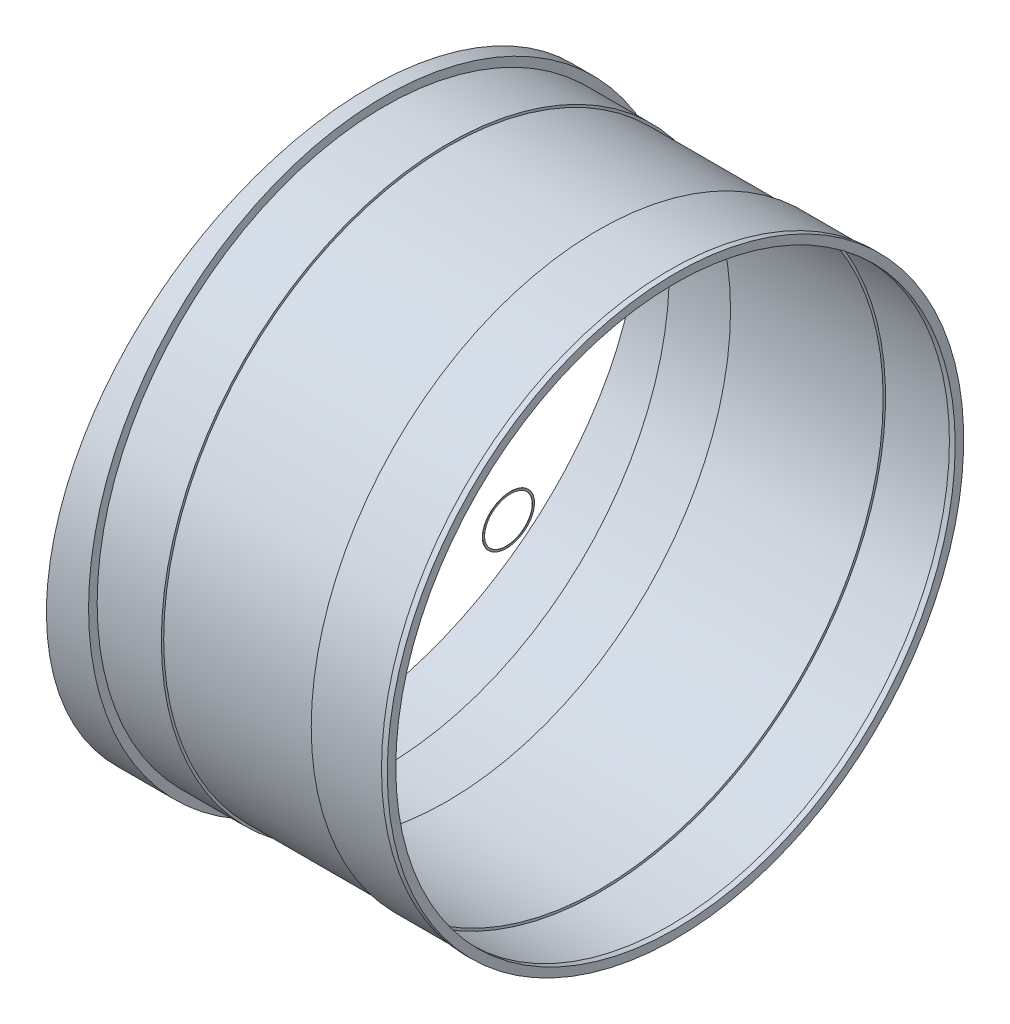
ISO-10303-21;
HEADER;
FILE_DESCRIPTION(('STEP AP214'),'2;1');
FILE_NAME('part.step','',(''),(''),'','','');
FILE_SCHEMA(('AUTOMOTIVE_DESIGN { 1 0 10303 214 1 1 1 1 }'));
ENDSEC;
DATA;
#1=APPLICATION_CONTEXT('core data for automotive mechanical design processes');
#2=APPLICATION_PROTOCOL_DEFINITION('international standard','automotive_design',2000,#1);
#3=PRODUCT_CONTEXT('',#1,'mechanical');
#4=PRODUCT('Part','Part','',(#3));
#5=PRODUCT_RELATED_PRODUCT_CATEGORY('part','',(#4));
#6=PRODUCT_DEFINITION_FORMATION('','',#4);
#7=PRODUCT_DEFINITION_CONTEXT('part definition',#1,'design');
#8=PRODUCT_DEFINITION('design','',#6,#7);
#9=PRODUCT_DEFINITION_SHAPE('','',#8);
#10=(LENGTH_UNIT() NAMED_UNIT(*) SI_UNIT(.MILLI.,.METRE.));
#11=(NAMED_UNIT(*) PLANE_ANGLE_UNIT() SI_UNIT($,.RADIAN.));
#12=(NAMED_UNIT(*) SI_UNIT($,.STERADIAN.) SOLID_ANGLE_UNIT());
#13=UNCERTAINTY_MEASURE_WITH_UNIT(LENGTH_MEASURE(1.E-05),#10,'distance_accuracy_value','');
#14=(GEOMETRIC_REPRESENTATION_CONTEXT(3) GLOBAL_UNCERTAINTY_ASSIGNED_CONTEXT((#13)) GLOBAL_UNIT_ASSIGNED_CONTEXT((#10,
#11,#12)) REPRESENTATION_CONTEXT('',''));
#15=CARTESIAN_POINT('',(0.,0.,0.));
#16=DIRECTION('',(0.,0.,1.));
#17=DIRECTION('',(1.,0.,0.));
#18=AXIS2_PLACEMENT_3D('',#15,#16,#17);
#19=CARTESIAN_POINT('',(-739.32525534607,34.3574521001771,-0.182478435002679));
#20=DIRECTION('',(-1.,0.,0.));
#21=DIRECTION('',(0.,0.,1.));
#22=AXIS2_PLACEMENT_3D('',#19,#20,#21);
#23=CYLINDRICAL_SURFACE('',#22,1156.34241950256);
#24=CARTESIAN_POINT('',(-477.882411014793,34.3574521001771,-0.182478435002679));
#25=DIRECTION('',(-1.,0.,0.));
#26=DIRECTION('',(0.,0.,1.));
#27=AXIS2_PLACEMENT_3D('',#24,#25,#26);
#28=CIRCLE('',#27,1156.34241950256);
#29=CARTESIAN_POINT('',(-477.882411014793,34.3574521001771,1156.15994106756));
#30=VERTEX_POINT('',#29);
#31=EDGE_CURVE('E81',#30,#30,#28,.T.);
#32=ORIENTED_EDGE('',*,*,#31,.T.);
#33=EDGE_LOOP('',(#32));
#34=FACE_BOUND('',#33,.T.);
#35=CARTESIAN_POINT('',(-638.158402485462,34.3574521001771,-0.182478435002679));
#36=DIRECTION('',(-0.996194698091746,0.0871557427476543,0.));
#37=DIRECTION('',(-0.0871557427476543,-0.996194698091746,0.));
#38=AXIS2_PLACEMENT_3D('',#35,#36,#37);
#39=ELLIPSE('',#38,1160.75945968954,1156.34241950256);
#40=CARTESIAN_POINT('',(-739.32525534607,-1121.98496740238,-0.182478435002679));
#41=VERTEX_POINT('',#40);
#42=EDGE_CURVE('E105',#41,#41,#39,.F.);
#43=ORIENTED_EDGE('',*,*,#42,.T.);
#44=EDGE_LOOP('',(#43));
#45=FACE_BOUND('',#44,.T.);
#46=ADVANCED_FACE('F43',(#34,#45),#23,.T.);
#47=CARTESIAN_POINT('',(-739.32525534607,34.3574521001771,-0.182478435002679));
#48=DIRECTION('',(-1.,0.,0.));
#49=DIRECTION('',(0.,0.,1.));
#50=AXIS2_PLACEMENT_3D('',#47,#48,#49);
#51=CYLINDRICAL_SURFACE('',#50,1152.57828411877);
#52=CARTESIAN_POINT('',(-481.553718996993,34.3574521001771,-0.182478435002679));
#53=DIRECTION('',(-1.,0.,0.));
#54=DIRECTION('',(0.,0.,1.));
#55=AXIS2_PLACEMENT_3D('',#52,#53,#54);
#56=CIRCLE('',#55,1152.57828411877);
#57=CARTESIAN_POINT('',(-481.553718996993,34.3574521001771,1152.39580568377));
#58=VERTEX_POINT('',#57);
#59=EDGE_CURVE('E84',#58,#58,#56,.T.);
#60=ORIENTED_EDGE('',*,*,#59,.F.);
#61=EDGE_LOOP('',(#60));
#62=FACE_BOUND('',#61,.T.);
#63=CARTESIAN_POINT('',(-638.158402485462,34.3574521001771,-0.182478435002679));
#64=DIRECTION('',(-0.996194698091746,0.0871557427476543,0.));
#65=DIRECTION('',(-0.0871557427476543,-0.996194698091746,0.));
#66=AXIS2_PLACEMENT_3D('',#63,#64,#65);
#67=ELLIPSE('',#66,1156.98094592009,1152.57828411877);
#68=CARTESIAN_POINT('',(-738.995936172012,-1118.22083201859,-0.182478435002679));
#69=VERTEX_POINT('',#68);
#70=EDGE_CURVE('E47',#69,#69,#67,.F.);
#71=ORIENTED_EDGE('',*,*,#70,.F.);
#72=EDGE_LOOP('',(#71));
#73=FACE_BOUND('',#72,.T.);
#74=ADVANCED_FACE('F114',(#62,#73),#51,.F.);
#75=CARTESIAN_POINT('',(638.985832011451,34.3574521001771,-0.182478435002679));
#76=DIRECTION('',(-1.,0.,0.));
#77=DIRECTION('',(0.,0.,1.));
#78=AXIS2_PLACEMENT_3D('',#75,#76,#77);
#79=PLANE('',#78);
#80=CARTESIAN_POINT('',(638.985832011451,34.3574521001771,-0.182478435002679));
#81=DIRECTION('',(-1.,0.,0.));
#82=DIRECTION('',(0.,0.,1.));
#83=AXIS2_PLACEMENT_3D('',#80,#81,#82);
#84=CIRCLE('',#83,1118.74566032021);
#85=CARTESIAN_POINT('',(638.985832011451,34.3574521001771,1118.5631818852));
#86=VERTEX_POINT('',#85);
#87=EDGE_CURVE('E102',#86,#86,#84,.T.);
#88=ORIENTED_EDGE('',*,*,#87,.T.);
#89=EDGE_LOOP('',(#88));
#90=FACE_BOUND('',#89,.T.);
#91=CARTESIAN_POINT('',(638.985832011451,34.3574521001771,-0.182478435002679));
#92=DIRECTION('',(-1.,0.,0.));
#93=DIRECTION('',(0.,0.,1.));
#94=AXIS2_PLACEMENT_3D('',#91,#92,#93);
#95=CIRCLE('',#94,1094.09192970876);
#96=CARTESIAN_POINT('',(638.985832011451,34.3574521001771,1093.90945127375));
#97=VERTEX_POINT('',#96);
#98=EDGE_CURVE('E11',#97,#97,#95,.T.);
#99=ORIENTED_EDGE('',*,*,#98,.F.);
#100=EDGE_LOOP('',(#99));
#101=FACE_BOUND('',#100,.T.);
#102=ADVANCED_FACE('F45',(#90,#101),#79,.T.);
#103=CARTESIAN_POINT('',(-739.32525534607,34.3574521001771,-0.182478435002679));
#104=DIRECTION('',(-1.,0.,0.));
#105=DIRECTION('',(0.,0.,1.));
#106=AXIS2_PLACEMENT_3D('',#103,#104,#105);
#107=CYLINDRICAL_SURFACE('',#106,1094.09192970876);
#108=ORIENTED_EDGE('',*,*,#98,.T.);
#109=EDGE_LOOP('',(#108));
#110=FACE_BOUND('',#109,.T.);
#111=CARTESIAN_POINT('',(661.552204701918,34.3574521001771,-0.182478435002679));
#112=DIRECTION('',(-1.,0.,0.));
#113=DIRECTION('',(0.,0.,1.));
#114=AXIS2_PLACEMENT_3D('',#111,#112,#113);
#115=CIRCLE('',#114,1094.09192970876);
#116=CARTESIAN_POINT('',(661.552204701918,34.3574521001771,1093.90945127375));
#117=VERTEX_POINT('',#116);
#118=EDGE_CURVE('E51',#117,#117,#115,.T.);
#119=ORIENTED_EDGE('',*,*,#118,.F.);
#120=EDGE_LOOP('',(#119));
#121=FACE_BOUND('',#120,.T.);
#122=ADVANCED_FACE('F122',(#110,#121),#107,.F.);
#123=CARTESIAN_POINT('',(661.552204701918,34.3574521001771,-0.182478435002679));
#124=DIRECTION('',(1.,0.,0.));
#125=DIRECTION('',(0.,0.,-1.));
#126=AXIS2_PLACEMENT_3D('',#123,#124,#125);
#127=PLANE('',#126);
#128=ORIENTED_EDGE('',*,*,#118,.T.);
#129=EDGE_LOOP('',(#128));
#130=FACE_BOUND('',#129,.T.);
#131=CARTESIAN_POINT('',(661.552204701918,34.3574521001771,-0.182478435002679));
#132=DIRECTION('',(-1.,0.,0.));
#133=DIRECTION('',(0.,0.,1.));
#134=AXIS2_PLACEMENT_3D('',#131,#132,#133);
#135=CIRCLE('',#134,1127.4062881664);
#136=CARTESIAN_POINT('',(661.552204701918,34.3574521001771,1127.2238097314));
#137=VERTEX_POINT('',#136);
#138=EDGE_CURVE('E55',#137,#137,#135,.T.);
#139=ORIENTED_EDGE('',*,*,#138,.F.);
#140=EDGE_LOOP('',(#139));
#141=FACE_BOUND('',#140,.T.);
#142=ADVANCED_FACE('F162',(#130,#141),#127,.T.);
#143=CARTESIAN_POINT('',(-739.32525534607,34.3574521001771,-0.182478435002679));
#144=DIRECTION('',(-1.,0.,0.));
#145=DIRECTION('',(0.,0.,1.));
#146=AXIS2_PLACEMENT_3D('',#143,#144,#145);
#147=CYLINDRICAL_SURFACE('',#146,1127.4062881664);
#148=ORIENTED_EDGE('',*,*,#138,.T.);
#149=EDGE_LOOP('',(#148));
#150=FACE_BOUND('',#149,.T.);
#151=CARTESIAN_POINT('',(638.985832011451,34.3574521001771,-0.182478435002679));
#152=DIRECTION('',(-1.,0.,0.));
#153=DIRECTION('',(0.,0.,1.));
#154=AXIS2_PLACEMENT_3D('',#151,#152,#153);
#155=CIRCLE('',#154,1127.4062881664);
#156=CARTESIAN_POINT('',(638.985832011451,34.3574521001771,1127.2238097314));
#157=VERTEX_POINT('',#156);
#158=EDGE_CURVE('E60',#157,#157,#155,.T.);
#159=ORIENTED_EDGE('',*,*,#158,.F.);
#160=EDGE_LOOP('',(#159));
#161=FACE_BOUND('',#160,.T.);
#162=ADVANCED_FACE('F158',(#150,#161),#147,.T.);
#163=CARTESIAN_POINT('',(638.985832011451,34.3574521001771,-0.182478435002679));
#164=DIRECTION('',(-1.,0.,0.));
#165=DIRECTION('',(0.,0.,1.));
#166=AXIS2_PLACEMENT_3D('',#163,#164,#165);
#167=PLANE('',#166);
#168=ORIENTED_EDGE('',*,*,#158,.T.);
#169=EDGE_LOOP('',(#168));
#170=FACE_BOUND('',#169,.T.);
#171=CARTESIAN_POINT('',(638.985832011451,34.3574521001771,-0.182478435002679));
#172=DIRECTION('',(-1.,0.,0.));
#173=DIRECTION('',(0.,0.,1.));
#174=AXIS2_PLACEMENT_3D('',#171,#172,#173);
#175=CIRCLE('',#174,1122.70778083857);
#176=CARTESIAN_POINT('',(638.985832011451,34.3574521001771,1122.52530240356));
#177=VERTEX_POINT('',#176);
#178=EDGE_CURVE('E63',#177,#177,#175,.T.);
#179=ORIENTED_EDGE('',*,*,#178,.F.);
#180=EDGE_LOOP('',(#179));
#181=FACE_BOUND('',#180,.T.);
#182=ADVANCED_FACE('F154',(#170,#181),#167,.T.);
#183=CARTESIAN_POINT('',(-739.32525534607,34.3574521001771,-0.182478435002679));
#184=DIRECTION('',(-1.,0.,0.));
#185=DIRECTION('',(0.,0.,1.));
#186=AXIS2_PLACEMENT_3D('',#183,#184,#185);
#187=CYLINDRICAL_SURFACE('',#186,1122.70778083857);
#188=ORIENTED_EDGE('',*,*,#178,.T.);
#189=EDGE_LOOP('',(#188));
#190=FACE_BOUND('',#189,.T.);
#191=CARTESIAN_POINT('',(359.448145681241,34.3574521001771,-0.182478435002679));
#192=DIRECTION('',(-1.,0.,0.));
#193=DIRECTION('',(0.,0.,1.));
#194=AXIS2_PLACEMENT_3D('',#191,#192,#193);
#195=CIRCLE('',#194,1122.70778083857);
#196=CARTESIAN_POINT('',(359.448145681241,34.3574521001771,1122.52530240356));
#197=VERTEX_POINT('',#196);
#198=EDGE_CURVE('E66',#197,#197,#195,.T.);
#199=ORIENTED_EDGE('',*,*,#198,.F.);
#200=EDGE_LOOP('',(#199));
#201=FACE_BOUND('',#200,.T.);
#202=ADVANCED_FACE('F150',(#190,#201),#187,.T.);
#203=CARTESIAN_POINT('',(359.448145681241,34.3574521001771,-0.182478435002679));
#204=DIRECTION('',(-1.,0.,0.));
#205=DIRECTION('',(0.,0.,1.));
#206=AXIS2_PLACEMENT_3D('',#203,#204,#205);
#207=PLANE('',#206);
#208=ORIENTED_EDGE('',*,*,#198,.T.);
#209=EDGE_LOOP('',(#208));
#210=FACE_BOUND('',#209,.T.);
#211=CARTESIAN_POINT('',(359.448145681241,34.3574521001771,-0.182478435002679));
#212=DIRECTION('',(-1.,0.,0.));
#213=DIRECTION('',(0.,0.,1.));
#214=AXIS2_PLACEMENT_3D('',#211,#212,#213);
#215=CIRCLE('',#214,1113.46129915592);
#216=CARTESIAN_POINT('',(359.448145681241,34.3574521001771,1113.27882072092));
#217=VERTEX_POINT('',#216);
#218=EDGE_CURVE('E69',#217,#217,#215,.T.);
#219=ORIENTED_EDGE('',*,*,#218,.F.);
#220=EDGE_LOOP('',(#219));
#221=FACE_BOUND('',#220,.T.);
#222=ADVANCED_FACE('F146',(#210,#221),#207,.T.);
#223=CARTESIAN_POINT('',(-739.32525534607,34.3574521001771,-0.182478435002679));
#224=DIRECTION('',(-1.,0.,0.));
#225=DIRECTION('',(0.,0.,1.));
#226=AXIS2_PLACEMENT_3D('',#223,#224,#225);
#227=CYLINDRICAL_SURFACE('',#226,1113.46129915592);
#228=ORIENTED_EDGE('',*,*,#218,.T.);
#229=EDGE_LOOP('',(#228));
#230=FACE_BOUND('',#229,.T.);
#231=CARTESIAN_POINT('',(-226.892026536555,34.3574521001771,-0.182478435002679));
#232=DIRECTION('',(-1.,0.,0.));
#233=DIRECTION('',(0.,0.,1.));
#234=AXIS2_PLACEMENT_3D('',#231,#232,#233);
#235=CIRCLE('',#234,1113.46129915592);
#236=CARTESIAN_POINT('',(-226.892026536555,34.3574521001771,1113.27882072092));
#237=VERTEX_POINT('',#236);
#238=EDGE_CURVE('E72',#237,#237,#235,.T.);
#239=ORIENTED_EDGE('',*,*,#238,.F.);
#240=EDGE_LOOP('',(#239));
#241=FACE_BOUND('',#240,.T.);
#242=ADVANCED_FACE('F142',(#230,#241),#227,.T.);
#243=CARTESIAN_POINT('',(-226.892026536555,34.3574521001771,-0.182478435002679));
#244=DIRECTION('',(1.,0.,0.));
#245=DIRECTION('',(0.,0.,-1.));
#246=AXIS2_PLACEMENT_3D('',#243,#244,#245);
#247=PLANE('',#246);
#248=ORIENTED_EDGE('',*,*,#238,.T.);
#249=EDGE_LOOP('',(#248));
#250=FACE_BOUND('',#249,.T.);
#251=CARTESIAN_POINT('',(-226.892026536555,34.3574521001771,-0.182478435002679));
#252=DIRECTION('',(-1.,0.,0.));
#253=DIRECTION('',(0.,0.,1.));
#254=AXIS2_PLACEMENT_3D('',#251,#252,#253);
#255=CIRCLE('',#254,1122.70778083857);
#256=CARTESIAN_POINT('',(-226.892026536555,34.3574521001771,1122.52530240356));
#257=VERTEX_POINT('',#256);
#258=EDGE_CURVE('E75',#257,#257,#255,.T.);
#259=ORIENTED_EDGE('',*,*,#258,.F.);
#260=EDGE_LOOP('',(#259));
#261=FACE_BOUND('',#260,.T.);
#262=ADVANCED_FACE('F138',(#250,#261),#247,.T.);
#263=CARTESIAN_POINT('',(-739.32525534607,34.3574521001771,-0.182478435002679));
#264=DIRECTION('',(-1.,0.,0.));
#265=DIRECTION('',(0.,0.,1.));
#266=AXIS2_PLACEMENT_3D('',#263,#264,#265);
#267=CYLINDRICAL_SURFACE('',#266,1122.70778083857);
#268=ORIENTED_EDGE('',*,*,#258,.T.);
#269=EDGE_LOOP('',(#268));
#270=FACE_BOUND('',#269,.T.);
#271=CARTESIAN_POINT('',(-477.882411014793,34.3574521001771,-0.182478435002679));
#272=DIRECTION('',(-1.,0.,0.));
#273=DIRECTION('',(0.,0.,1.));
#274=AXIS2_PLACEMENT_3D('',#271,#272,#273);
#275=CIRCLE('',#274,1122.70778083857);
#276=CARTESIAN_POINT('',(-477.882411014793,34.3574521001771,1122.52530240356));
#277=VERTEX_POINT('',#276);
#278=EDGE_CURVE('E78',#277,#277,#275,.T.);
#279=ORIENTED_EDGE('',*,*,#278,.F.);
#280=EDGE_LOOP('',(#279));
#281=FACE_BOUND('',#280,.T.);
#282=ADVANCED_FACE('F134',(#270,#281),#267,.T.);
#283=CARTESIAN_POINT('',(-477.882411014793,34.3574521001771,-0.182478435002679));
#284=DIRECTION('',(1.,0.,0.));
#285=DIRECTION('',(0.,0.,-1.));
#286=AXIS2_PLACEMENT_3D('',#283,#284,#285);
#287=PLANE('',#286);
#288=ORIENTED_EDGE('',*,*,#278,.T.);
#289=EDGE_LOOP('',(#288));
#290=FACE_BOUND('',#289,.T.);
#291=ORIENTED_EDGE('',*,*,#31,.F.);
#292=EDGE_LOOP('',(#291));
#293=FACE_BOUND('',#292,.T.);
#294=ADVANCED_FACE('F131',(#290,#293),#287,.T.);
#295=CARTESIAN_POINT('',(-481.553718996993,34.3574521001771,-0.182478435002679));
#296=DIRECTION('',(1.,0.,0.));
#297=DIRECTION('',(0.,0.,-1.));
#298=AXIS2_PLACEMENT_3D('',#295,#296,#297);
#299=PLANE('',#298);
#300=CARTESIAN_POINT('',(-481.553718996993,34.3574521001771,-0.182478435002679));
#301=DIRECTION('',(-1.,0.,0.));
#302=DIRECTION('',(0.,0.,1.));
#303=AXIS2_PLACEMENT_3D('',#300,#301,#302);
#304=CIRCLE('',#303,1118.74566032021);
#305=CARTESIAN_POINT('',(-481.553718996993,34.3574521001771,1118.5631818852));
#306=VERTEX_POINT('',#305);
#307=EDGE_CURVE('E87',#306,#306,#304,.T.);
#308=ORIENTED_EDGE('',*,*,#307,.F.);
#309=EDGE_LOOP('',(#308));
#310=FACE_BOUND('',#309,.T.);
#311=ORIENTED_EDGE('',*,*,#59,.T.);
#312=EDGE_LOOP('',(#311));
#313=FACE_BOUND('',#312,.T.);
#314=ADVANCED_FACE('F128',(#310,#313),#299,.F.);
#315=CARTESIAN_POINT('',(-739.32525534607,34.3574521001771,-0.182478435002679));
#316=DIRECTION('',(-1.,0.,0.));
#317=DIRECTION('',(0.,0.,1.));
#318=AXIS2_PLACEMENT_3D('',#315,#316,#317);
#319=CYLINDRICAL_SURFACE('',#318,1118.74566032021);
#320=CARTESIAN_POINT('',(-232.610160771384,34.3574521001771,-0.182478435002679));
#321=DIRECTION('',(-1.,0.,0.));
#322=DIRECTION('',(0.,0.,1.));
#323=AXIS2_PLACEMENT_3D('',#320,#321,#322);
#324=CIRCLE('',#323,1118.74566032021);
#325=CARTESIAN_POINT('',(-232.610160771384,34.3574521001771,1118.5631818852));
#326=VERTEX_POINT('',#325);
#327=EDGE_CURVE('E90',#326,#326,#324,.T.);
#328=ORIENTED_EDGE('',*,*,#327,.F.);
#329=EDGE_LOOP('',(#328));
#330=FACE_BOUND('',#329,.T.);
#331=ORIENTED_EDGE('',*,*,#307,.T.);
#332=EDGE_LOOP('',(#331));
#333=FACE_BOUND('',#332,.T.);
#334=ADVANCED_FACE('F233',(#330,#333),#319,.F.);
#335=CARTESIAN_POINT('',(-232.610160771384,34.3574521001771,-0.182478435002679));
#336=DIRECTION('',(1.,0.,0.));
#337=DIRECTION('',(0.,0.,-1.));
#338=AXIS2_PLACEMENT_3D('',#335,#336,#337);
#339=PLANE('',#338);
#340=CARTESIAN_POINT('',(-232.610160771384,34.3574521001771,-0.182478435002679));
#341=DIRECTION('',(-1.,0.,0.));
#342=DIRECTION('',(0.,0.,1.));
#343=AXIS2_PLACEMENT_3D('',#340,#341,#342);
#344=CIRCLE('',#343,1109.48945498159);
#345=CARTESIAN_POINT('',(-232.610160771384,34.3574521001771,1109.30697654658));
#346=VERTEX_POINT('',#345);
#347=EDGE_CURVE('E93',#346,#346,#344,.T.);
#348=ORIENTED_EDGE('',*,*,#347,.F.);
#349=EDGE_LOOP('',(#348));
#350=FACE_BOUND('',#349,.T.);
#351=ORIENTED_EDGE('',*,*,#327,.T.);
#352=EDGE_LOOP('',(#351));
#353=FACE_BOUND('',#352,.T.);
#354=ADVANCED_FACE('F240',(#350,#353),#339,.F.);
#355=CARTESIAN_POINT('',(-739.32525534607,34.3574521001771,-0.182478435002679));
#356=DIRECTION('',(-1.,0.,0.));
#357=DIRECTION('',(0.,0.,1.));
#358=AXIS2_PLACEMENT_3D('',#355,#356,#357);
#359=CYLINDRICAL_SURFACE('',#358,1109.48945498159);
#360=CARTESIAN_POINT('',(364.410364551892,34.3574521001771,-0.182478435002679));
#361=DIRECTION('',(-1.,0.,0.));
#362=DIRECTION('',(0.,0.,1.));
#363=AXIS2_PLACEMENT_3D('',#360,#361,#362);
#364=CIRCLE('',#363,1109.48945498159);
#365=CARTESIAN_POINT('',(364.410364551892,34.3574521001771,1109.30697654658));
#366=VERTEX_POINT('',#365);
#367=EDGE_CURVE('E96',#366,#366,#364,.T.);
#368=ORIENTED_EDGE('',*,*,#367,.F.);
#369=EDGE_LOOP('',(#368));
#370=FACE_BOUND('',#369,.T.);
#371=ORIENTED_EDGE('',*,*,#347,.T.);
#372=EDGE_LOOP('',(#371));
#373=FACE_BOUND('',#372,.T.);
#374=ADVANCED_FACE('F247',(#370,#373),#359,.F.);
#375=CARTESIAN_POINT('',(364.410364551892,34.3574521001771,-0.182478435002679));
#376=DIRECTION('',(-1.,0.,0.));
#377=DIRECTION('',(0.,0.,1.));
#378=AXIS2_PLACEMENT_3D('',#375,#376,#377);
#379=PLANE('',#378);
#380=CARTESIAN_POINT('',(364.410364551892,34.3574521001771,-0.182478435002679));
#381=DIRECTION('',(-1.,0.,0.));
#382=DIRECTION('',(0.,0.,1.));
#383=AXIS2_PLACEMENT_3D('',#380,#381,#382);
#384=CIRCLE('',#383,1118.74566032021);
#385=CARTESIAN_POINT('',(364.410364551892,34.3574521001771,1118.5631818852));
#386=VERTEX_POINT('',#385);
#387=EDGE_CURVE('E99',#386,#386,#384,.T.);
#388=ORIENTED_EDGE('',*,*,#387,.F.);
#389=EDGE_LOOP('',(#388));
#390=FACE_BOUND('',#389,.T.);
#391=ORIENTED_EDGE('',*,*,#367,.T.);
#392=EDGE_LOOP('',(#391));
#393=FACE_BOUND('',#392,.T.);
#394=ADVANCED_FACE('F255',(#390,#393),#379,.F.);
#395=CARTESIAN_POINT('',(-739.32525534607,34.3574521001771,-0.182478435002679));
#396=DIRECTION('',(-1.,0.,0.));
#397=DIRECTION('',(0.,0.,1.));
#398=AXIS2_PLACEMENT_3D('',#395,#396,#397);
#399=CYLINDRICAL_SURFACE('',#398,1118.74566032021);
#400=ORIENTED_EDGE('',*,*,#87,.F.);
#401=EDGE_LOOP('',(#400));
#402=FACE_BOUND('',#401,.T.);
#403=ORIENTED_EDGE('',*,*,#387,.T.);
#404=EDGE_LOOP('',(#403));
#405=FACE_BOUND('',#404,.T.);
#406=ADVANCED_FACE('F263',(#402,#405),#399,.F.);
#407=CARTESIAN_POINT('',(-634.930532445921,71.2521754786492,-113.514214061284));
#408=DIRECTION('',(-0.996194698091746,0.0871557427476543,0.));
#409=DIRECTION('',(-0.0871557427476543,-0.996194698091746,0.));
#410=AXIS2_PLACEMENT_3D('',#407,#408,#409);
#411=PLANE('',#410);
#412=ORIENTED_EDGE('',*,*,#42,.F.);
#413=EDGE_LOOP('',(#412));
#414=FACE_BOUND('',#413,.T.);
#415=ORIENTED_EDGE('',*,*,#70,.T.);
#416=EDGE_LOOP('',(#415));
#417=FACE_BOUND('',#416,.T.);
#418=ADVANCED_FACE('F112',(#414,#417),#411,.T.);
#419=CLOSED_SHELL('',(#46,#74,#102,#122,#142,#162,#182,#202,#222,#242,#262,#282,#294,#314,#334,
#354,#374,#394,#406,#418));
#420=MANIFOLD_SOLID_BREP('B2',#419);
#421=CARTESIAN_POINT('',(7.55616015890316,-0.661078353690241,0.));
#422=DIRECTION('',(-0.996194698091746,0.0871557427476543,0.));
#423=DIRECTION('',(-0.0871557427476543,-0.996194698091746,0.));
#424=AXIS2_PLACEMENT_3D('',#421,#422,#423);
#425=PLANE('',#424);
#426=CARTESIAN_POINT('',(7.55616015890316,-0.661078353690241,0.));
#427=DIRECTION('',(-0.996194698091746,0.0871557427476543,0.));
#428=DIRECTION('',(-0.0871557427476543,-0.996194698091746,0.));
#429=AXIS2_PLACEMENT_3D('',#426,#427,#428);
#430=CIRCLE('',#429,101.213381326121);
#431=CARTESIAN_POINT('',(-1.26516726657652,-101.48931220671,0.));
#432=VERTEX_POINT('',#431);
#433=EDGE_CURVE('E42',#432,#432,#430,.T.);
#434=ORIENTED_EDGE('',*,*,#433,.T.);
#435=EDGE_LOOP('',(#434));
#436=FACE_BOUND('',#435,.T.);
#437=CARTESIAN_POINT('',(7.55616015890316,-0.661078353690241,0.));
#438=DIRECTION('',(-0.996194698091746,0.0871557427476543,0.));
#439=DIRECTION('',(-0.0871557427476543,-0.996194698091746,0.));
#440=AXIS2_PLACEMENT_3D('',#437,#438,#439);
#441=CIRCLE('',#440,93.3820075730115);
#442=CARTESIAN_POINT('',(-0.582618070389739,-93.6877391950876,0.));
#443=VERTEX_POINT('',#442);
#444=EDGE_CURVE('E365',#443,#443,#441,.T.);
#445=ORIENTED_EDGE('',*,*,#444,.F.);
#446=EDGE_LOOP('',(#445));
#447=FACE_BOUND('',#446,.T.);
#448=ADVANCED_FACE('F354',(#436,#447),#425,.T.);
#449=CARTESIAN_POINT('',(8.82132742547968,-0.771766146979762,0.));
#450=DIRECTION('',(-0.996194698091746,0.0871557427476543,0.));
#451=DIRECTION('',(-0.0871557427476543,-0.996194698091746,0.));
#452=AXIS2_PLACEMENT_3D('',#449,#450,#451);
#453=PLANE('',#452);
#454=CARTESIAN_POINT('',(8.82132742547968,-0.771766146979762,0.));
#455=DIRECTION('',(-0.996194698091746,0.0871557427476543,0.));
#456=DIRECTION('',(-0.0871557427476543,-0.996194698091746,0.));
#457=AXIS2_PLACEMENT_3D('',#454,#455,#456);
#458=CIRCLE('',#457,101.213381326121);
#459=CARTESIAN_POINT('',(0.,-101.6,0.));
#460=VERTEX_POINT('',#459);
#461=EDGE_CURVE('E358',#460,#460,#458,.T.);
#462=ORIENTED_EDGE('',*,*,#461,.F.);
#463=EDGE_LOOP('',(#462));
#464=FACE_BOUND('',#463,.T.);
#465=CARTESIAN_POINT('',(8.82132742547968,-0.771766146979762,0.));
#466=DIRECTION('',(-0.996194698091746,0.0871557427476543,0.));
#467=DIRECTION('',(-0.0871557427476543,-0.996194698091746,0.));
#468=AXIS2_PLACEMENT_3D('',#465,#466,#467);
#469=CIRCLE('',#468,93.3820075730115);
#470=CARTESIAN_POINT('',(0.682549196186778,-93.7984269883771,0.));
#471=VERTEX_POINT('',#470);
#472=EDGE_CURVE('E367',#471,#471,#469,.T.);
#473=ORIENTED_EDGE('',*,*,#472,.T.);
#474=EDGE_LOOP('',(#473));
#475=FACE_BOUND('',#474,.T.);
#476=ADVANCED_FACE('F377',(#464,#475),#453,.F.);
#477=CARTESIAN_POINT('',(7.55616015890316,-0.661078353690241,0.));
#478=DIRECTION('',(0.996194698091746,-0.0871557427476543,0.));
#479=DIRECTION('',(0.0871557427476543,0.996194698091746,0.));
#480=AXIS2_PLACEMENT_3D('',#477,#478,#479);
#481=CYLINDRICAL_SURFACE('',#480,101.213381326121);
#482=ORIENTED_EDGE('',*,*,#433,.F.);
#483=EDGE_LOOP('',(#482));
#484=FACE_BOUND('',#483,.T.);
#485=ORIENTED_EDGE('',*,*,#461,.T.);
#486=EDGE_LOOP('',(#485));
#487=FACE_BOUND('',#486,.T.);
#488=ADVANCED_FACE('F356',(#484,#487),#481,.T.);
#489=CARTESIAN_POINT('',(7.55616015890316,-0.661078353690241,0.));
#490=DIRECTION('',(0.996194698091746,-0.0871557427476543,0.));
#491=DIRECTION('',(0.0871557427476543,0.996194698091746,0.));
#492=AXIS2_PLACEMENT_3D('',#489,#490,#491);
#493=CYLINDRICAL_SURFACE('',#492,93.3820075730115);
#494=ORIENTED_EDGE('',*,*,#444,.T.);
#495=EDGE_LOOP('',(#494));
#496=FACE_BOUND('',#495,.T.);
#497=ORIENTED_EDGE('',*,*,#472,.F.);
#498=EDGE_LOOP('',(#497));
#499=FACE_BOUND('',#498,.T.);
#500=ADVANCED_FACE('F373',(#496,#499),#493,.F.);
#501=CLOSED_SHELL('',(#448,#476,#488,#500));
#502=MANIFOLD_SOLID_BREP('B6',#501);
#503=ADVANCED_BREP_SHAPE_REPRESENTATION('',(#18,#420,#502),#14);
#504=SHAPE_DEFINITION_REPRESENTATION(#9,#503);
ENDSEC;
END-ISO-10303-21;
